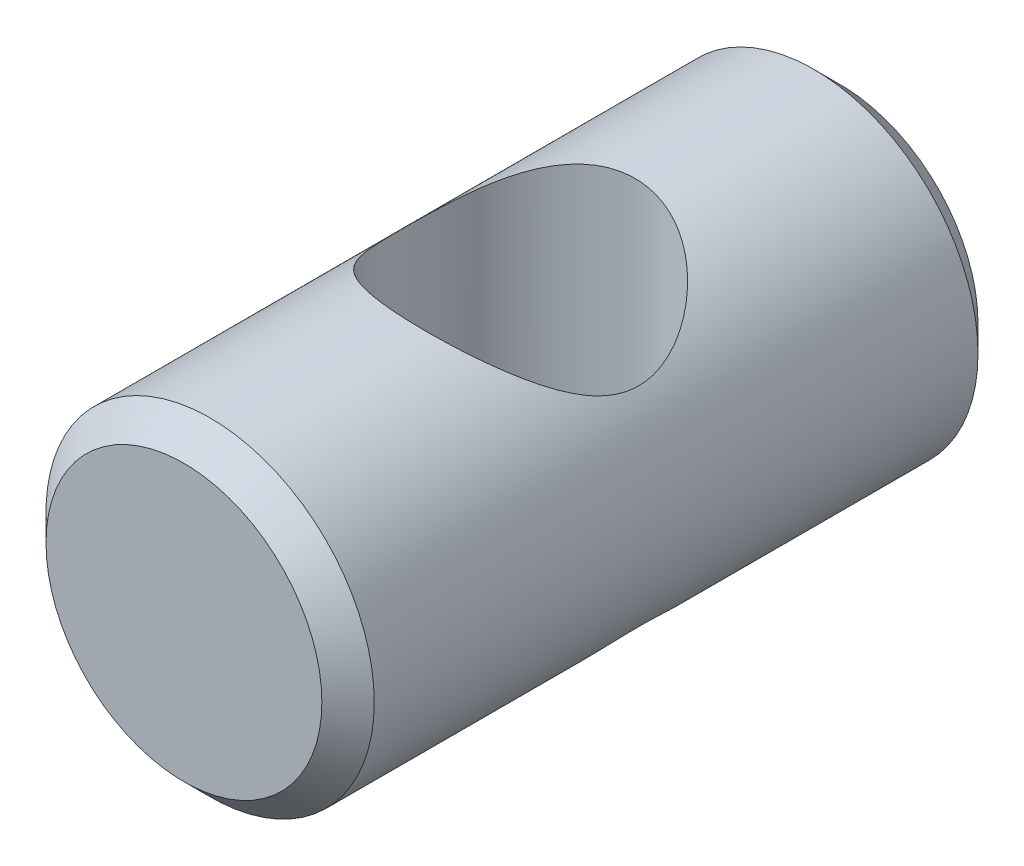
ISO-10303-21;
HEADER;
FILE_DESCRIPTION(('STEP AP214'),'2;1');
FILE_NAME('part.step','',(''),(''),'','','');
FILE_SCHEMA(('AUTOMOTIVE_DESIGN { 1 0 10303 214 1 1 1 1 }'));
ENDSEC;
DATA;
#1=APPLICATION_CONTEXT('core data for automotive mechanical design processes');
#2=APPLICATION_PROTOCOL_DEFINITION('international standard','automotive_design',2000,#1);
#3=PRODUCT_CONTEXT('',#1,'mechanical');
#4=PRODUCT('Part','Part','',(#3));
#5=PRODUCT_RELATED_PRODUCT_CATEGORY('part','',(#4));
#6=PRODUCT_DEFINITION_FORMATION('','',#4);
#7=PRODUCT_DEFINITION_CONTEXT('part definition',#1,'design');
#8=PRODUCT_DEFINITION('design','',#6,#7);
#9=PRODUCT_DEFINITION_SHAPE('','',#8);
#10=(LENGTH_UNIT() NAMED_UNIT(*) SI_UNIT(.MILLI.,.METRE.));
#11=(NAMED_UNIT(*) PLANE_ANGLE_UNIT() SI_UNIT($,.RADIAN.));
#12=(NAMED_UNIT(*) SI_UNIT($,.STERADIAN.) SOLID_ANGLE_UNIT());
#13=UNCERTAINTY_MEASURE_WITH_UNIT(LENGTH_MEASURE(1.E-05),#10,'distance_accuracy_value','');
#14=(GEOMETRIC_REPRESENTATION_CONTEXT(3) GLOBAL_UNCERTAINTY_ASSIGNED_CONTEXT((#13)) GLOBAL_UNIT_ASSIGNED_CONTEXT((#10,
#11,#12)) REPRESENTATION_CONTEXT('',''));
#15=CARTESIAN_POINT('',(0.,0.,0.));
#16=DIRECTION('',(0.,0.,1.));
#17=DIRECTION('',(1.,0.,0.));
#18=AXIS2_PLACEMENT_3D('',#15,#16,#17);
#19=CARTESIAN_POINT('',(0.,0.,9.525));
#20=DIRECTION('',(0.,0.,-1.));
#21=DIRECTION('',(-1.,0.,0.));
#22=AXIS2_PLACEMENT_3D('',#19,#20,#21);
#23=CYLINDRICAL_SURFACE('',#22,4.765);
#24=CARTESIAN_POINT('',(0.,0.,-8.76499999999999));
#25=DIRECTION('',(0.,0.,1.));
#26=DIRECTION('',(1.,0.,0.));
#27=AXIS2_PLACEMENT_3D('',#24,#25,#26);
#28=CIRCLE('',#27,4.765);
#29=CARTESIAN_POINT('',(4.765,0.,-8.76499999999999));
#30=VERTEX_POINT('',#29);
#31=EDGE_CURVE('E44',#30,#30,#28,.T.);
#32=ORIENTED_EDGE('',*,*,#31,.T.);
#33=EDGE_LOOP('',(#32));
#34=FACE_BOUND('',#33,.T.);
#35=CARTESIAN_POINT('',(0.,0.,8.76500000000001));
#36=DIRECTION('',(0.,0.,1.));
#37=DIRECTION('',(1.,0.,0.));
#38=AXIS2_PLACEMENT_3D('',#35,#36,#37);
#39=CIRCLE('',#38,4.765);
#40=CARTESIAN_POINT('',(4.765,0.,8.76500000000001));
#41=VERTEX_POINT('',#40);
#42=EDGE_CURVE('E48',#41,#41,#39,.F.);
#43=ORIENTED_EDGE('',*,*,#42,.T.);
#44=EDGE_LOOP('',(#43));
#45=FACE_BOUND('',#44,.T.);
#46=CARTESIAN_POINT('',(0.,-4.765,-3.42087708051605));
#47=CARTESIAN_POINT('',(-0.0856942510059222,-4.76500372406179,-3.41461845405845));
#48=CARTESIAN_POINT('',(-0.171121100206974,-4.76268528674186,-3.40513185664892));
#49=CARTESIAN_POINT('',(-0.340815163949196,-4.75355458297263,-3.3798209799213));
#50=CARTESIAN_POINT('',(-0.425082157083864,-4.74674147034843,-3.36399550745666));
#51=CARTESIAN_POINT('',(-0.591815819068765,-4.72884919919637,-3.32619287103985));
#52=CARTESIAN_POINT('',(-0.674281275080604,-4.71776725496124,-3.30421169262714));
#53=CARTESIAN_POINT('',(-0.836795481484615,-4.69167199758972,-3.25438345334717));
#54=CARTESIAN_POINT('',(-0.916843174546032,-4.67665699144282,-3.22653386740008));
#55=CARTESIAN_POINT('',(-1.15161088782801,-4.62649388533987,-3.13503201933925));
#56=CARTESIAN_POINT('',(-1.30210455493484,-4.58609564145861,-3.06316075101044));
#57=CARTESIAN_POINT('',(-1.58863168547318,-4.49490342184667,-2.90027011950621));
#58=CARTESIAN_POINT('',(-1.72466521273604,-4.44410949200855,-2.8092508408611));
#59=CARTESIAN_POINT('',(-1.99344316901954,-4.33066983387455,-2.60068581749612));
#60=CARTESIAN_POINT('',(-2.12455950948192,-4.26735049915497,-2.48141483397178));
#61=CARTESIAN_POINT('',(-2.36662844877739,-4.13801271400532,-2.22471339631871));
#62=CARTESIAN_POINT('',(-2.47754400950904,-4.07198957219361,-2.0872503679407));
#63=CARTESIAN_POINT('',(-2.63522008426459,-3.97058736699203,-1.85762881960823));
#64=CARTESIAN_POINT('',(-2.68927381649975,-3.93405791672857,-1.77089868261764));
#65=CARTESIAN_POINT('',(-2.7898123672948,-3.86341055651136,-1.59215475247703));
#66=CARTESIAN_POINT('',(-2.83629536118039,-3.82929322903742,-1.50013969277935));
#67=CARTESIAN_POINT('',(-2.92109506219807,-3.76500433588578,-1.31138394914416));
#68=CARTESIAN_POINT('',(-2.95943224889948,-3.73482295044036,-1.21465588622808));
#69=CARTESIAN_POINT('',(-3.02751038617565,-3.67985289464928,-1.01675067628099));
#70=CARTESIAN_POINT('',(-3.05725266863841,-3.65506338891177,-0.915574221386683));
#71=CARTESIAN_POINT('',(-3.11687147939033,-3.6045001534632,-0.670994772419579));
#72=CARTESIAN_POINT('',(-3.1426716573391,-3.58179904614131,-0.525900399043321));
#73=CARTESIAN_POINT('',(-3.17531879928657,-3.55289761873413,-0.232127458475882));
#74=CARTESIAN_POINT('',(-3.18219321735307,-3.54667339746892,-0.083454398975065));
#75=CARTESIAN_POINT('',(-3.17657749143383,-3.55170212546434,0.21331728734135));
#76=CARTESIAN_POINT('',(-3.16407499232303,-3.56296622565023,0.361415487241703));
#77=CARTESIAN_POINT('',(-3.12052786613102,-3.60115736376545,0.652864674015799));
#78=CARTESIAN_POINT('',(-3.08945551925451,-3.62810781563299,0.796208225157674));
#79=CARTESIAN_POINT('',(-2.99939551024929,-3.7031254731471,1.113834133153));
#80=CARTESIAN_POINT('',(-2.935059493251,-3.75497411677657,1.28568810104235));
#81=CARTESIAN_POINT('',(-2.78193078819236,-3.86978306225472,1.61407604920641));
#82=CARTESIAN_POINT('',(-2.69310335851004,-3.93275910264603,1.77058783551896));
#83=CARTESIAN_POINT('',(-2.4912979885232,-4.06367063457592,2.0696195035013));
#84=CARTESIAN_POINT('',(-2.37789966570814,-4.13167682450423,2.21182316788456));
#85=CARTESIAN_POINT('',(-2.12925717522726,-4.2651343082136,2.47731111793097));
#86=CARTESIAN_POINT('',(-1.99400822055652,-4.33058503823793,2.60059124628564));
#87=CARTESIAN_POINT('',(-1.76705738343921,-4.42612763761141,2.77615470390877));
#88=CARTESIAN_POINT('',(-1.6822445834248,-4.45914566450104,2.83587617597991));
#89=CARTESIAN_POINT('',(-1.50659920639215,-4.52150995180942,2.947896944092));
#90=CARTESIAN_POINT('',(-1.41576961857281,-4.55085801488201,3.00019988575807));
#91=CARTESIAN_POINT('',(-1.22866881482431,-4.60489675490913,3.09669333580215));
#92=CARTESIAN_POINT('',(-1.13240204741352,-4.62959116958818,3.14089035393788));
#93=CARTESIAN_POINT('',(-0.935098556820257,-4.67343743710795,3.22051991832548));
#94=CARTESIAN_POINT('',(-0.834063119610056,-4.69259077439564,3.25595481156827));
#95=CARTESIAN_POINT('',(-0.643011205494899,-4.72225783820339,3.31298838642537));
#96=CARTESIAN_POINT('',(-0.553499932720004,-4.73361796210781,3.33584407298325));
#97=CARTESIAN_POINT('',(-0.372452914467138,-4.75129170146378,3.37431676551974));
#98=CARTESIAN_POINT('',(-0.280917553453983,-4.75760626697296,3.38993513402243));
#99=CARTESIAN_POINT('',(-0.0967371116157213,-4.76490794866924,3.41369053940287));
#100=CARTESIAN_POINT('',(-0.00409298485153282,-4.76589935536381,3.42183359704886));
#101=CARTESIAN_POINT('',(0.181418156766344,-4.76245075257907,3.43057334885341));
#102=CARTESIAN_POINT('',(0.274285147372987,-4.75801130940609,3.4311708297596));
#103=CARTESIAN_POINT('',(0.525402140212853,-4.73860365154558,3.42259332577953));
#104=CARTESIAN_POINT('',(0.683080399868526,-4.71838660580482,3.40615014047491));
#105=CARTESIAN_POINT('',(0.992055912085097,-4.66323470196912,3.35244843254439));
#106=CARTESIAN_POINT('',(1.14335212857024,-4.62829746420291,3.31518654404212));
#107=CARTESIAN_POINT('',(1.4403709352981,-4.54477683855939,3.22069256193487));
#108=CARTESIAN_POINT('',(1.58583077351322,-4.49584879234044,3.16294586849736));
#109=CARTESIAN_POINT('',(1.86441880924205,-4.38765715004444,3.03024615278744));
#110=CARTESIAN_POINT('',(1.99754518152055,-4.32839202790804,2.95529058945734));
#111=CARTESIAN_POINT('',(2.27097103888529,-4.19224174473938,2.77694263666353));
#112=CARTESIAN_POINT('',(2.40888984782925,-4.11405974263684,2.67090512984919));
#113=CARTESIAN_POINT('',(2.66587906112291,-3.95239056473024,2.44095262310581));
#114=CARTESIAN_POINT('',(2.78491038380749,-3.86889287710437,2.3170015431911));
#115=CARTESIAN_POINT('',(2.95944836917975,-3.73546390997119,2.10578327830163));
#116=CARTESIAN_POINT('',(3.02130520302377,-3.68548107882744,2.0237036190676));
#117=CARTESIAN_POINT('',(3.13777568238829,-3.58683785296792,1.85371866080111));
#118=CARTESIAN_POINT('',(3.19238662314116,-3.53817795744017,1.76581120461187));
#119=CARTESIAN_POINT('',(3.29391986716952,-3.44385098338172,1.58437306567781));
#120=CARTESIAN_POINT('',(3.34085609211771,-3.39817857804186,1.49085299510459));
#121=CARTESIAN_POINT('',(3.42662377857565,-3.31167359664885,1.29810668122894));
#122=CARTESIAN_POINT('',(3.46546161115912,-3.27083722705749,1.19888500242192));
#123=CARTESIAN_POINT('',(3.54120497188103,-3.18885516595158,0.974440490747448));
#124=CARTESIAN_POINT('',(3.57619062301583,-3.1492626339122,0.847970637553343));
#125=CARTESIAN_POINT('',(3.63174972945766,-3.08503730320172,0.588391612874334));
#126=CARTESIAN_POINT('',(3.65235728655054,-3.06036912574004,0.455298958800162));
#127=CARTESIAN_POINT('',(3.67777071315275,-3.02979706874601,0.184194545370658));
#128=CARTESIAN_POINT('',(3.68244175304891,-3.02405331165103,0.04615075019365));
#129=CARTESIAN_POINT('',(3.6751244389998,-3.03293601525138,-0.22886900679424));
#130=CARTESIAN_POINT('',(3.66312499986099,-3.0475760303441,-0.365844197101761));
#131=CARTESIAN_POINT('',(3.62122925120972,-3.09726630105768,-0.650230171928315));
#132=CARTESIAN_POINT('',(3.58937336547909,-3.13453780226407,-0.796943421401724));
#133=CARTESIAN_POINT('',(3.508654337231,-3.22462114118857,-1.08072293758561));
#134=CARTESIAN_POINT('',(3.45974705679341,-3.27747325429306,-1.21776304727642));
#135=CARTESIAN_POINT('',(3.36301407675573,-3.37619758620276,-1.44380487587525));
#136=CARTESIAN_POINT('',(3.31880941649885,-3.41980345352406,-1.53541472914784));
#137=CARTESIAN_POINT('',(3.22318686460508,-3.51007278340862,-1.71325899124101));
#138=CARTESIAN_POINT('',(3.17176598967204,-3.55673750627696,-1.79949115543573));
#139=CARTESIAN_POINT('',(3.06199483422709,-3.6516691140298,-1.96661914900772));
#140=CARTESIAN_POINT('',(3.00363765010073,-3.69993756007587,-2.04750953513389));
#141=CARTESIAN_POINT('',(2.88022236229035,-3.79680115463074,-2.20380218805042));
#142=CARTESIAN_POINT('',(2.81516393657853,-3.84539631873498,-2.27920419079938));
#143=CARTESIAN_POINT('',(2.67676457623467,-3.94303263591416,-2.4261391389075));
#144=CARTESIAN_POINT('',(2.60325744667227,-3.99205464797062,-2.49752854458933));
#145=CARTESIAN_POINT('',(2.44945432768786,-4.0882302310309,-2.63398346451988));
#146=CARTESIAN_POINT('',(2.36915847098096,-4.13538383853433,-2.69904910234063));
#147=CARTESIAN_POINT('',(2.20207272913392,-4.22671789334807,-2.82224391386082));
#148=CARTESIAN_POINT('',(2.11529478200156,-4.27090353485644,-2.88038535111654));
#149=CARTESIAN_POINT('',(1.93540157787959,-4.35537950017704,-2.98921049190835));
#150=CARTESIAN_POINT('',(1.84228618810119,-4.3956697423259,-3.03989403910843));
#151=CARTESIAN_POINT('',(1.60007775045864,-4.49105515072698,-3.15729530247129));
#152=CARTESIAN_POINT('',(1.44704004279908,-4.54296413284264,-3.21865913496703));
#153=CARTESIAN_POINT('',(1.12993645286048,-4.63200684267677,-3.3193657103388));
#154=CARTESIAN_POINT('',(0.96588716282533,-4.66916224170543,-3.35874078699293));
#155=CARTESIAN_POINT('',(0.667836753392528,-4.7198321934562,-3.40702933763492));
#156=CARTESIAN_POINT('',(0.535175413725972,-4.73675120565746,-3.42074184495159));
#157=CARTESIAN_POINT('',(0.268125701070824,-4.75933258257015,-3.43254995015108));
#158=CARTESIAN_POINT('',(0.133737212222471,-4.76499418810905,-3.43064449484029));
#159=CARTESIAN_POINT('',(0.,-4.765,-3.42087708051605));
#160=B_SPLINE_CURVE_WITH_KNOTS('',3,(#46,#47,#48,#49,#50,#51,#52,#53,#54,#55,#56,#57,#58,#59,
#60,#61,#62,#63,#64,#65,#66,#67,#68,#69,#70,#71,#72,#73,#74,#75,#76,#77,#78,#79,#80,#81,#82,#83,
#84,#85,#86,#87,#88,#89,#90,#91,#92,#93,#94,#95,#96,#97,#98,#99,#100,#101,#102,#103,#104,#105,
#106,#107,#108,#109,#110,#111,#112,#113,#114,#115,#116,#117,#118,#119,#120,#121,#122,#123,#124,
#125,#126,#127,#128,#129,#130,#131,#132,#133,#134,#135,#136,#137,#138,#139,#140,#141,#142,#143,
#144,#145,#146,#147,#148,#149,#150,#151,#152,#153,#154,#155,#156,#157,#158,#159),.UNSPECIFIED.,
.T.,.F.,(4,2,2,2,2,2,2,2,2,2,2,2,2,2,2,2,2,2,2,2,2,2,2,2,2,2,2,2,2,2,2,2,2,2,2,2,2,2,2,2,2,2,2,
2,2,2,2,2,2,2,2,2,2,2,2,2,4),(0.,0.257622698048237,0.515293910411776,0.773133556664686,
1.03108437448132,1.54347148068929,2.05585632497401,2.61844275267492,3.18205051961308,
3.50728342339531,3.83259459810832,4.1570779608603,4.48151101385633,4.92678697222646,
5.37141666361017,5.81632997678325,6.26190909071532,6.83091206396529,7.40072637063391,
7.98119155491015,8.5617840795358,8.88795315539233,9.21396138526207,9.53970664481247,
9.86536455667517,10.1441842796832,10.4229514897185,10.7014939774448,10.9800074224003,
11.4570142229675,11.9340981662221,12.4241316247447,12.9142374880829,13.4844043505898,
14.0557360264669,14.3982708931589,14.7409332646616,15.0829669920992,15.4247306149621,
15.8344527346029,16.2431997463018,16.655396466846,17.0678674127493,17.5294161680566,
17.9921686334037,18.3237849761703,18.6555388204231,18.9876256640975,19.3197284736399,
19.6601202402325,20.0005053539297,20.3402783466007,20.6800584607475,21.1964020749097,
21.7119844090775,22.1140115905448,22.5160658828429),.UNSPECIFIED.);
#161=CARTESIAN_POINT('',(0.,-4.765,-3.42087708051605));
#162=VERTEX_POINT('',#161);
#163=EDGE_CURVE('E53',#162,#162,#160,.T.);
#164=ORIENTED_EDGE('',*,*,#163,.T.);
#165=EDGE_LOOP('',(#164));
#166=FACE_BOUND('',#165,.T.);
#167=CARTESIAN_POINT('',(0.25,4.75843724346555,3.43));
#168=CARTESIAN_POINT('',(0.166724112169052,4.76281167621829,3.42999922787093));
#169=CARTESIAN_POINT('',(0.0833091871232495,4.76499730659661,3.42696170981832));
#170=CARTESIAN_POINT('',(-0.0831121740296209,4.7650026918208,3.4148068467804));
#171=CARTESIAN_POINT('',(-0.166118334391627,4.76281982101014,3.40568584755888));
#172=CARTESIAN_POINT('',(-0.331186959790398,4.75419585970188,3.38143299325718));
#173=CARTESIAN_POINT('',(-0.413247381645857,4.74774685395692,3.36628998600944));
#174=CARTESIAN_POINT('',(-0.57566379669092,4.7308054983668,3.33018248201757));
#175=CARTESIAN_POINT('',(-0.656019036141793,4.72031139819935,3.30921546630946));
#176=CARTESIAN_POINT('',(-0.892787966377315,4.68332033908369,3.23819654976144));
#177=CARTESIAN_POINT('',(-1.04595137150619,4.65125389258668,3.17986930590837));
#178=CARTESIAN_POINT('',(-1.33984014973707,4.57527843427845,3.04361904551389));
#179=CARTESIAN_POINT('',(-1.48056835886066,4.5313721320163,2.96570051271122));
#180=CARTESIAN_POINT('',(-1.75788689740451,4.43151908585651,2.78614227044201));
#181=CARTESIAN_POINT('',(-1.89336529725831,4.37491413457117,2.68315702445496));
#182=CARTESIAN_POINT('',(-2.14655524443234,4.25642076403591,2.45967503555252));
#183=CARTESIAN_POINT('',(-2.26424375736879,4.1945256545925,2.33915597919725));
#184=CARTESIAN_POINT('',(-2.49954291256701,4.05942448373215,2.06004986641744));
#185=CARTESIAN_POINT('',(-2.61358783923186,3.98612152048065,1.89848678532065));
#186=CARTESIAN_POINT('',(-2.8134167940547,3.84768475167639,1.55552772477578));
#187=CARTESIAN_POINT('',(-2.8992289351292,3.78254285998121,1.37415171538822));
#188=CARTESIAN_POINT('',(-3.02121659224799,3.68536960684574,1.04249027419633));
#189=CARTESIAN_POINT('',(-3.06446847823432,3.64913089405156,0.896059930245659));
#190=CARTESIAN_POINT('',(-3.13130443601069,3.59195313084762,0.595994145022528));
#191=CARTESIAN_POINT('',(-3.15492488386826,3.57098579230857,0.442372589402982));
#192=CARTESIAN_POINT('',(-3.18107400515714,3.54772325730842,0.130968163534102));
#193=CARTESIAN_POINT('',(-3.1834814102325,3.54553541923722,-0.0268334663617312));
#194=CARTESIAN_POINT('',(-3.16668321345997,3.56054009581889,-0.340378540732285));
#195=CARTESIAN_POINT('',(-3.14746550747579,3.57774346424277,-0.496120783126502));
#196=CARTESIAN_POINT('',(-3.0909210961652,3.62666135115865,-0.789904337023397));
#197=CARTESIAN_POINT('',(-3.0549866148247,3.65725103780534,-0.928415250197685));
#198=CARTESIAN_POINT('',(-2.96728528802359,3.72875878634848,-1.19751261050963));
#199=CARTESIAN_POINT('',(-2.91550550146166,3.76968528568752,-1.3280924753778));
#200=CARTESIAN_POINT('',(-2.77052705474688,3.87825771410624,-1.63782460440973));
#201=CARTESIAN_POINT('',(-2.66921327673824,3.9495685015488,-1.81191316545693));
#202=CARTESIAN_POINT('',(-2.4387535532021,4.09590072272998,-2.13907509935082));
#203=CARTESIAN_POINT('',(-2.30955797140353,4.17092858781235,-2.29211018589258));
#204=CARTESIAN_POINT('',(-2.02402160906534,4.31676779733467,-2.57575490113864));
#205=CARTESIAN_POINT('',(-1.86747364912315,4.38754097750563,-2.70617703034937));
#206=CARTESIAN_POINT('',(-1.53024851972964,4.51618771874562,-2.93894144764791));
#207=CARTESIAN_POINT('',(-1.34962456620741,4.57408899880651,-3.04134418612298));
#208=CARTESIAN_POINT('',(-1.01242767734236,4.65865916827853,-3.19328266988702));
#209=CARTESIAN_POINT('',(-0.859923323449718,4.68945201631652,-3.24956507034397));
#210=CARTESIAN_POINT('',(-0.546356902825547,4.73621910160439,-3.34025251275025));
#211=CARTESIAN_POINT('',(-0.385300834260463,4.75220358398007,-3.37467267483606));
#212=CARTESIAN_POINT('',(-0.0585909892563553,4.76745293508549,-3.42008033355065));
#213=CARTESIAN_POINT('',(0.107075469726218,4.76666592499011,-3.43099500658852));
#214=CARTESIAN_POINT('',(0.437263524427022,4.74777547003753,-3.42886170148299));
#215=CARTESIAN_POINT('',(0.601785009912756,4.72967038048901,-3.41581144729144));
#216=CARTESIAN_POINT('',(0.917023455984582,4.67852691536303,-3.36811701365221));
#217=CARTESIAN_POINT('',(1.06802543846496,4.64623395849401,-3.33452146005276));
#218=CARTESIAN_POINT('',(1.36114282577409,4.56897312306875,-3.2486320258752));
#219=CARTESIAN_POINT('',(1.5032561767415,4.52400232821754,-3.19633384236941));
#220=CARTESIAN_POINT('',(1.78918123830801,4.41920416422592,-3.06961312822602));
#221=CARTESIAN_POINT('',(1.93190566387653,4.35837989651049,-2.99357734594169));
#222=CARTESIAN_POINT('',(2.20254689954151,4.22807467175417,-2.82452841204479));
#223=CARTESIAN_POINT('',(2.3304539546229,4.15858807365445,-2.73150417873574));
#224=CARTESIAN_POINT('',(2.59396805594881,4.00055978130538,-2.51111133608925));
#225=CARTESIAN_POINT('',(2.72627669731259,3.9109325153004,-2.38058009592622));
#226=CARTESIAN_POINT('',(2.96812567159531,3.73070877587188,-2.100243948315));
#227=CARTESIAN_POINT('',(3.07764472575726,3.64011147895989,-1.95042123769023));
#228=CARTESIAN_POINT('',(3.25959426369705,3.47751484837525,-1.65330676505373));
#229=CARTESIAN_POINT('',(3.33502083401563,3.40464496946818,-1.50833136837071));
#230=CARTESIAN_POINT('',(3.46586658517558,3.2713441238456,-1.20430907278381));
#231=CARTESIAN_POINT('',(3.52132872734755,3.21088656913652,-1.04529331737331));
#232=CARTESIAN_POINT('',(3.59765604252707,3.124823861218,-0.757665304054351));
#233=CARTESIAN_POINT('',(3.62377560920146,3.09423907936361,-0.63197555915028));
#234=CARTESIAN_POINT('',(3.66180814769204,3.04914510271432,-0.375721470658427));
#235=CARTESIAN_POINT('',(3.67374715513707,3.03460645057289,-0.245166515787294));
#236=CARTESIAN_POINT('',(3.68248381420053,3.02400445245463,0.0177966534529442));
#237=CARTESIAN_POINT('',(3.67921741545453,3.02801925946825,0.150210360703108));
#238=CARTESIAN_POINT('',(3.65769938197026,3.0539665857314,0.412078573372208));
#239=CARTESIAN_POINT('',(3.63942784679228,3.07592289956546,0.54152891416466));
#240=CARTESIAN_POINT('',(3.58281700309049,3.14180670904453,0.826729712346175));
#241=CARTESIAN_POINT('',(3.54052764492096,3.18993005386834,0.980691312065216));
#242=CARTESIAN_POINT('',(3.43738681858182,3.30080253377366,1.2767906566915));
#243=CARTESIAN_POINT('',(3.37648537626474,3.36359093675505,1.41889524108079));
#244=CARTESIAN_POINT('',(3.25927230939949,3.4766169791788,1.64936888169118));
#245=CARTESIAN_POINT('',(3.20719498221027,3.52486634365835,1.7409394575126));
#246=CARTESIAN_POINT('',(3.09541954727663,3.62341667346676,1.91819495195357));
#247=CARTESIAN_POINT('',(3.03571875143679,3.67371835818199,2.0038777780348));
#248=CARTESIAN_POINT('',(2.90891804374965,3.77491865704642,2.16931406665596));
#249=CARTESIAN_POINT('',(2.84181267646787,3.82581768629146,2.24906308395903));
#250=CARTESIAN_POINT('',(2.70038920437342,3.92691720618763,2.40236682455076));
#251=CARTESIAN_POINT('',(2.62607150215374,3.9771177356504,2.47592189315842));
#252=CARTESIAN_POINT('',(2.46949972376396,4.0762079661732,2.61724277483524));
#253=CARTESIAN_POINT('',(2.38716864979552,4.1250776725309,2.68493753880603));
#254=CARTESIAN_POINT('',(2.21541256265412,4.21980975535666,2.81310096557155));
#255=CARTESIAN_POINT('',(2.1259865725645,4.26567171608716,2.87356863036593));
#256=CARTESIAN_POINT('',(1.94048293416798,4.35318701528819,2.98645656939565));
#257=CARTESIAN_POINT('',(1.8444179349447,4.39484800441004,3.03889156631573));
#258=CARTESIAN_POINT('',(1.64605779138663,4.47292957405361,3.1349771488852));
#259=CARTESIAN_POINT('',(1.54376590080899,4.50935285855684,3.17863227184576));
#260=CARTESIAN_POINT('',(1.28981920639204,4.58975257088416,3.27242101077825));
#261=CARTESIAN_POINT('',(1.1352862763967,4.63059676914717,3.31773285408371));
#262=CARTESIAN_POINT('',(0.89790283907342,4.68033819384841,3.36922808334745));
#263=CARTESIAN_POINT('',(0.817919413239363,4.69498977614935,3.38364210754005));
#264=CARTESIAN_POINT('',(0.656514982838959,4.7202607906775,3.4067980569507));
#265=CARTESIAN_POINT('',(0.575094809436485,4.73088247904069,3.41554315786432));
#266=CARTESIAN_POINT('',(0.452884075948463,4.74360353870641,3.42423436805334));
#267=CARTESIAN_POINT('',(0.412398045833618,4.74729478081944,3.42639368476122));
#268=CARTESIAN_POINT('',(0.331285742741572,4.75364382663165,3.42927683030824));
#269=CARTESIAN_POINT('',(0.290659443770019,4.7563014271186,3.43000037699194));
#270=CARTESIAN_POINT('',(0.25,4.75843724346555,3.43));
#271=B_SPLINE_CURVE_WITH_KNOTS('',3,(#167,#168,#169,#170,#171,#172,#173,#174,#175,#176,#177,
#178,#179,#180,#181,#182,#183,#184,#185,#186,#187,#188,#189,#190,#191,#192,#193,#194,#195,#196,
#197,#198,#199,#200,#201,#202,#203,#204,#205,#206,#207,#208,#209,#210,#211,#212,#213,#214,#215,
#216,#217,#218,#219,#220,#221,#222,#223,#224,#225,#226,#227,#228,#229,#230,#231,#232,#233,#234,
#235,#236,#237,#238,#239,#240,#241,#242,#243,#244,#245,#246,#247,#248,#249,#250,#251,#252,#253,
#254,#255,#256,#257,#258,#259,#260,#261,#262,#263,#264,#265,#266,#267,#268,#269,#270),
.UNSPECIFIED.,.T.,.F.,(4,2,2,2,2,2,2,2,2,2,2,2,2,2,2,2,2,2,2,2,2,2,2,2,2,2,2,2,2,2,2,2,2,2,2,2,
2,2,2,2,2,2,2,2,2,2,2,2,2,2,2,4),(0.,0.250128749904401,0.500407883064132,0.751152683255352,
1.00200610335284,1.5005745207861,1.99902893760549,2.53506428284883,3.0717878497701,
3.7017577007417,4.33109834451233,4.80006775596797,5.26816624101772,5.73893897524922,
6.20997534433429,6.6473510237769,7.08508487226794,7.72280008470007,8.36166008801208,
9.005587331222,9.64811417987124,10.1423678843309,10.636279384842,11.1317189102055,
11.6272054919413,12.0992981890246,12.5714995707697,13.0879217874425,13.6046820813895,
14.2214259135373,14.8387430440107,15.373911233242,15.9079208139713,16.3022952653857,
16.6959445170977,17.0912534507832,17.4870875080064,17.9846304730142,18.483521274847,
18.8307287538683,19.1780590008212,19.5256468793742,19.8732153666977,20.2245350343439,
20.5759031603044,20.926619370564,21.2771538674155,21.7730640559323,22.0205706255638,
22.2679384234592,22.3900397673761,22.512165104096),.UNSPECIFIED.);
#272=CARTESIAN_POINT('',(0.25,4.75843724346555,3.43));
#273=VERTEX_POINT('',#272);
#274=EDGE_CURVE('E61',#273,#273,#271,.T.);
#275=ORIENTED_EDGE('',*,*,#274,.T.);
#276=EDGE_LOOP('',(#275));
#277=FACE_BOUND('',#276,.T.);
#278=ADVANCED_FACE('F32',(#34,#45,#166,#277),#23,.T.);
#279=CARTESIAN_POINT('',(0.,0.,9.525));
#280=DIRECTION('',(0.,0.,1.));
#281=DIRECTION('',(1.,0.,0.));
#282=AXIS2_PLACEMENT_3D('',#279,#280,#281);
#283=PLANE('',#282);
#284=CARTESIAN_POINT('',(0.,0.,9.525));
#285=DIRECTION('',(0.,0.,1.));
#286=DIRECTION('',(1.,0.,0.));
#287=AXIS2_PLACEMENT_3D('',#284,#285,#286);
#288=CIRCLE('',#287,4.00500000000001);
#289=CARTESIAN_POINT('',(4.00500000000001,0.,9.525));
#290=VERTEX_POINT('',#289);
#291=EDGE_CURVE('E10',#290,#290,#288,.T.);
#292=ORIENTED_EDGE('',*,*,#291,.T.);
#293=EDGE_LOOP('',(#292));
#294=FACE_BOUND('',#293,.T.);
#295=ADVANCED_FACE('F74',(#294),#283,.T.);
#296=CARTESIAN_POINT('',(0.,0.,-9.525));
#297=DIRECTION('',(0.,0.,1.));
#298=DIRECTION('',(1.,0.,0.));
#299=AXIS2_PLACEMENT_3D('',#296,#297,#298);
#300=PLANE('',#299);
#301=CARTESIAN_POINT('',(0.,0.,-9.525));
#302=DIRECTION('',(0.,0.,1.));
#303=DIRECTION('',(1.,0.,0.));
#304=AXIS2_PLACEMENT_3D('',#301,#302,#303);
#305=CIRCLE('',#304,4.00499999999998);
#306=CARTESIAN_POINT('',(4.00499999999998,0.,-9.525));
#307=VERTEX_POINT('',#306);
#308=EDGE_CURVE('E40',#307,#307,#305,.F.);
#309=ORIENTED_EDGE('',*,*,#308,.T.);
#310=EDGE_LOOP('',(#309));
#311=FACE_BOUND('',#310,.T.);
#312=ADVANCED_FACE('F72',(#311),#300,.F.);
#313=CARTESIAN_POINT('',(0.25,-4.765,0.));
#314=DIRECTION('',(0.,1.,0.));
#315=DIRECTION('',(0.,0.,1.));
#316=AXIS2_PLACEMENT_3D('',#313,#314,#315);
#317=CYLINDRICAL_SURFACE('',#316,3.43);
#318=ORIENTED_EDGE('',*,*,#274,.F.);
#319=EDGE_LOOP('',(#318));
#320=FACE_BOUND('',#319,.T.);
#321=ORIENTED_EDGE('',*,*,#163,.F.);
#322=EDGE_LOOP('',(#321));
#323=FACE_BOUND('',#322,.T.);
#324=ADVANCED_FACE('F67',(#320,#323),#317,.F.);
#325=CARTESIAN_POINT('',(0.,0.,-8.76499999999999));
#326=DIRECTION('',(0.,0.,1.));
#327=DIRECTION('',(1.,0.,0.));
#328=AXIS2_PLACEMENT_3D('',#325,#326,#327);
#329=CONICAL_SURFACE('',#328,4.765,0.785398163397451);
#330=ORIENTED_EDGE('',*,*,#308,.F.);
#331=EDGE_LOOP('',(#330));
#332=FACE_BOUND('',#331,.T.);
#333=ORIENTED_EDGE('',*,*,#31,.F.);
#334=EDGE_LOOP('',(#333));
#335=FACE_BOUND('',#334,.T.);
#336=ADVANCED_FACE('F71',(#332,#335),#329,.T.);
#337=CARTESIAN_POINT('',(0.,0.,9.525));
#338=DIRECTION('',(0.,0.,-1.));
#339=DIRECTION('',(-1.,0.,0.));
#340=AXIS2_PLACEMENT_3D('',#337,#338,#339);
#341=CONICAL_SURFACE('',#340,4.00500000000001,0.785398163397448);
#342=ORIENTED_EDGE('',*,*,#42,.F.);
#343=EDGE_LOOP('',(#342));
#344=FACE_BOUND('',#343,.T.);
#345=ORIENTED_EDGE('',*,*,#291,.F.);
#346=EDGE_LOOP('',(#345));
#347=FACE_BOUND('',#346,.T.);
#348=ADVANCED_FACE('F35',(#344,#347),#341,.T.);
#349=CLOSED_SHELL('',(#278,#295,#312,#324,#336,#348));
#350=MANIFOLD_SOLID_BREP('B2',#349);
#351=ADVANCED_BREP_SHAPE_REPRESENTATION('',(#18,#350),#14);
#352=SHAPE_DEFINITION_REPRESENTATION(#9,#351);
ENDSEC;
END-ISO-10303-21;
